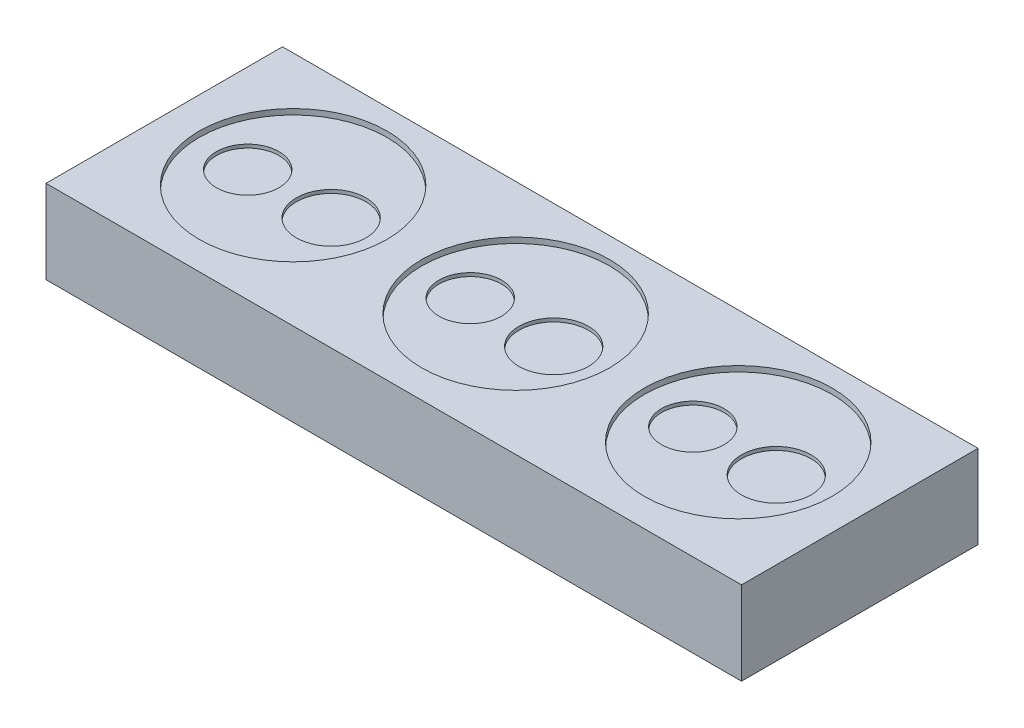
ISO-10303-21;
HEADER;
FILE_DESCRIPTION(('STEP AP214'),'2;1');
FILE_NAME('part.step','',(''),(''),'','','');
FILE_SCHEMA(('AUTOMOTIVE_DESIGN { 1 0 10303 214 1 1 1 1 }'));
ENDSEC;
DATA;
#1=APPLICATION_CONTEXT('core data for automotive mechanical design processes');
#2=APPLICATION_PROTOCOL_DEFINITION('international standard','automotive_design',2000,#1);
#3=PRODUCT_CONTEXT('',#1,'mechanical');
#4=PRODUCT('Part','Part','',(#3));
#5=PRODUCT_RELATED_PRODUCT_CATEGORY('part','',(#4));
#6=PRODUCT_DEFINITION_FORMATION('','',#4);
#7=PRODUCT_DEFINITION_CONTEXT('part definition',#1,'design');
#8=PRODUCT_DEFINITION('design','',#6,#7);
#9=PRODUCT_DEFINITION_SHAPE('','',#8);
#10=(LENGTH_UNIT() NAMED_UNIT(*) SI_UNIT(.MILLI.,.METRE.));
#11=(NAMED_UNIT(*) PLANE_ANGLE_UNIT() SI_UNIT($,.RADIAN.));
#12=(NAMED_UNIT(*) SI_UNIT($,.STERADIAN.) SOLID_ANGLE_UNIT());
#13=UNCERTAINTY_MEASURE_WITH_UNIT(LENGTH_MEASURE(1.E-05),#10,'distance_accuracy_value','');
#14=(GEOMETRIC_REPRESENTATION_CONTEXT(3) GLOBAL_UNCERTAINTY_ASSIGNED_CONTEXT((#13)) GLOBAL_UNIT_ASSIGNED_CONTEXT((#10,
#11,#12)) REPRESENTATION_CONTEXT('',''));
#15=CARTESIAN_POINT('',(0.,0.,0.));
#16=DIRECTION('',(0.,0.,1.));
#17=DIRECTION('',(1.,0.,0.));
#18=AXIS2_PLACEMENT_3D('',#15,#16,#17);
#19=CARTESIAN_POINT('',(-255.514705882353,60.,-108.455882352941));
#20=DIRECTION('',(1.,0.,0.));
#21=DIRECTION('',(0.,0.,-1.));
#22=AXIS2_PLACEMENT_3D('',#19,#20,#21);
#23=PLANE('',#22);
#24=DIRECTION('',(0.,0.,1.));
#25=VECTOR('',#24,1.);
#26=CARTESIAN_POINT('',(-255.514705882353,0.,-108.455882352941));
#27=LINE('',#26,#25);
#28=CARTESIAN_POINT('',(-255.514705882353,0.,-108.455882352941));
#29=VERTEX_POINT('',#28);
#30=CARTESIAN_POINT('',(-255.514705882353,0.,61.5441176470588));
#31=VERTEX_POINT('',#30);
#32=EDGE_CURVE('E96',#29,#31,#27,.T.);
#33=ORIENTED_EDGE('',*,*,#32,.T.);
#34=DIRECTION('',(0.,-1.,0.));
#35=VECTOR('',#34,1.);
#36=CARTESIAN_POINT('',(-255.514705882353,60.,61.5441176470588));
#37=LINE('',#36,#35);
#38=CARTESIAN_POINT('',(-255.514705882353,60.,61.5441176470588));
#39=VERTEX_POINT('',#38);
#40=EDGE_CURVE('E11',#39,#31,#37,.T.);
#41=ORIENTED_EDGE('',*,*,#40,.F.);
#42=DIRECTION('',(0.,0.,1.));
#43=VECTOR('',#42,1.);
#44=CARTESIAN_POINT('',(-255.514705882353,60.,-108.455882352941));
#45=LINE('',#44,#43);
#46=CARTESIAN_POINT('',(-255.514705882353,60.,-108.455882352941));
#47=VERTEX_POINT('',#46);
#48=EDGE_CURVE('E84',#47,#39,#45,.T.);
#49=ORIENTED_EDGE('',*,*,#48,.F.);
#50=DIRECTION('',(0.,-1.,0.));
#51=VECTOR('',#50,1.);
#52=CARTESIAN_POINT('',(-255.514705882353,60.,-108.455882352941));
#53=LINE('',#52,#51);
#54=EDGE_CURVE('E92',#47,#29,#53,.T.);
#55=ORIENTED_EDGE('',*,*,#54,.T.);
#56=EDGE_LOOP('',(#33,#41,#49,#55));
#57=FACE_BOUND('',#56,.T.);
#58=ADVANCED_FACE('F33',(#57),#23,.F.);
#59=CARTESIAN_POINT('',(-255.514705882353,60.,61.5441176470588));
#60=DIRECTION('',(0.,0.,-1.));
#61=DIRECTION('',(-1.,0.,0.));
#62=AXIS2_PLACEMENT_3D('',#59,#60,#61);
#63=PLANE('',#62);
#64=DIRECTION('',(1.,0.,0.));
#65=VECTOR('',#64,1.);
#66=CARTESIAN_POINT('',(-255.514705882353,0.,61.5441176470588));
#67=LINE('',#66,#65);
#68=CARTESIAN_POINT('',(244.485294117647,0.,61.5441176470588));
#69=VERTEX_POINT('',#68);
#70=EDGE_CURVE('E88',#31,#69,#67,.T.);
#71=ORIENTED_EDGE('',*,*,#70,.T.);
#72=DIRECTION('',(0.,-1.,0.));
#73=VECTOR('',#72,1.);
#74=CARTESIAN_POINT('',(244.485294117647,60.,61.5441176470588));
#75=LINE('',#74,#73);
#76=CARTESIAN_POINT('',(244.485294117647,60.,61.5441176470588));
#77=VERTEX_POINT('',#76);
#78=EDGE_CURVE('E41',#77,#69,#75,.T.);
#79=ORIENTED_EDGE('',*,*,#78,.F.);
#80=DIRECTION('',(1.,0.,0.));
#81=VECTOR('',#80,1.);
#82=CARTESIAN_POINT('',(-255.514705882353,60.,61.5441176470588));
#83=LINE('',#82,#81);
#84=EDGE_CURVE('E79',#39,#77,#83,.T.);
#85=ORIENTED_EDGE('',*,*,#84,.F.);
#86=ORIENTED_EDGE('',*,*,#40,.T.);
#87=EDGE_LOOP('',(#71,#79,#85,#86));
#88=FACE_BOUND('',#87,.T.);
#89=ADVANCED_FACE('F87',(#88),#63,.F.);
#90=CARTESIAN_POINT('',(244.485294117647,60.,-108.455882352941));
#91=DIRECTION('',(-1.,0.,0.));
#92=DIRECTION('',(0.,0.,1.));
#93=AXIS2_PLACEMENT_3D('',#90,#91,#92);
#94=PLANE('',#93);
#95=DIRECTION('',(0.,0.,-1.));
#96=VECTOR('',#95,1.);
#97=CARTESIAN_POINT('',(244.485294117647,0.,-108.455882352941));
#98=LINE('',#97,#96);
#99=CARTESIAN_POINT('',(244.485294117647,0.,-108.455882352941));
#100=VERTEX_POINT('',#99);
#101=EDGE_CURVE('E66',#69,#100,#98,.T.);
#102=ORIENTED_EDGE('',*,*,#101,.T.);
#103=DIRECTION('',(0.,-1.,0.));
#104=VECTOR('',#103,1.);
#105=CARTESIAN_POINT('',(244.485294117647,60.,-108.455882352941));
#106=LINE('',#105,#104);
#107=CARTESIAN_POINT('',(244.485294117647,60.,-108.455882352941));
#108=VERTEX_POINT('',#107);
#109=EDGE_CURVE('E89',#108,#100,#106,.T.);
#110=ORIENTED_EDGE('',*,*,#109,.F.);
#111=DIRECTION('',(0.,0.,-1.));
#112=VECTOR('',#111,1.);
#113=CARTESIAN_POINT('',(244.485294117647,60.,-108.455882352941));
#114=LINE('',#113,#112);
#115=EDGE_CURVE('E82',#77,#108,#114,.T.);
#116=ORIENTED_EDGE('',*,*,#115,.F.);
#117=ORIENTED_EDGE('',*,*,#78,.T.);
#118=EDGE_LOOP('',(#102,#110,#116,#117));
#119=FACE_BOUND('',#118,.T.);
#120=ADVANCED_FACE('F90',(#119),#94,.F.);
#121=CARTESIAN_POINT('',(-255.514705882353,60.,-108.455882352941));
#122=DIRECTION('',(0.,0.,1.));
#123=DIRECTION('',(1.,0.,0.));
#124=AXIS2_PLACEMENT_3D('',#121,#122,#123);
#125=PLANE('',#124);
#126=DIRECTION('',(-1.,0.,0.));
#127=VECTOR('',#126,1.);
#128=CARTESIAN_POINT('',(-255.514705882353,0.,-108.455882352941));
#129=LINE('',#128,#127);
#130=EDGE_CURVE('E72',#100,#29,#129,.T.);
#131=ORIENTED_EDGE('',*,*,#130,.T.);
#132=ORIENTED_EDGE('',*,*,#54,.F.);
#133=DIRECTION('',(-1.,0.,0.));
#134=VECTOR('',#133,1.);
#135=CARTESIAN_POINT('',(-255.514705882353,60.,-108.455882352941));
#136=LINE('',#135,#134);
#137=EDGE_CURVE('E49',#108,#47,#136,.T.);
#138=ORIENTED_EDGE('',*,*,#137,.F.);
#139=ORIENTED_EDGE('',*,*,#109,.T.);
#140=EDGE_LOOP('',(#131,#132,#138,#139));
#141=FACE_BOUND('',#140,.T.);
#142=ADVANCED_FACE('F104',(#141),#125,.F.);
#143=CARTESIAN_POINT('',(0.,60.,0.));
#144=DIRECTION('',(0.,1.,0.));
#145=DIRECTION('',(0.,0.,1.));
#146=AXIS2_PLACEMENT_3D('',#143,#144,#145);
#147=PLANE('',#146);
#148=CARTESIAN_POINT('',(-165.514705882353,60.,-26.0941233594731));
#149=DIRECTION('',(0.,1.,0.));
#150=DIRECTION('',(0.,0.,1.));
#151=AXIS2_PLACEMENT_3D('',#148,#149,#150);
#152=CIRCLE('',#151,67.5);
#153=CARTESIAN_POINT('',(-165.514705882353,60.,41.4058766405269));
#154=VERTEX_POINT('',#153);
#155=EDGE_CURVE('E116',#154,#154,#152,.T.);
#156=ORIENTED_EDGE('',*,*,#155,.F.);
#157=EDGE_LOOP('',(#156));
#158=FACE_BOUND('',#157,.T.);
#159=CARTESIAN_POINT('',(154.485294117647,60.,-26.0941233594731));
#160=DIRECTION('',(0.,1.,0.));
#161=DIRECTION('',(0.,0.,1.));
#162=AXIS2_PLACEMENT_3D('',#159,#160,#161);
#163=CIRCLE('',#162,67.5);
#164=CARTESIAN_POINT('',(154.485294117647,60.,41.4058766405269));
#165=VERTEX_POINT('',#164);
#166=EDGE_CURVE('E123',#165,#165,#163,.T.);
#167=ORIENTED_EDGE('',*,*,#166,.F.);
#168=EDGE_LOOP('',(#167));
#169=FACE_BOUND('',#168,.T.);
#170=CARTESIAN_POINT('',(-5.51470588235306,60.,-26.0941233594731));
#171=DIRECTION('',(0.,1.,0.));
#172=DIRECTION('',(0.,0.,1.));
#173=AXIS2_PLACEMENT_3D('',#170,#171,#172);
#174=CIRCLE('',#173,67.5);
#175=CARTESIAN_POINT('',(-5.51470588235306,60.,41.4058766405269));
#176=VERTEX_POINT('',#175);
#177=EDGE_CURVE('E110',#176,#176,#174,.T.);
#178=ORIENTED_EDGE('',*,*,#177,.F.);
#179=EDGE_LOOP('',(#178));
#180=FACE_BOUND('',#179,.T.);
#181=ORIENTED_EDGE('',*,*,#48,.T.);
#182=ORIENTED_EDGE('',*,*,#84,.T.);
#183=ORIENTED_EDGE('',*,*,#115,.T.);
#184=ORIENTED_EDGE('',*,*,#137,.T.);
#185=EDGE_LOOP('',(#181,#182,#183,#184));
#186=FACE_BOUND('',#185,.T.);
#187=ADVANCED_FACE('F80',(#158,#169,#180,#186),#147,.T.);
#188=CARTESIAN_POINT('',(0.,0.,0.));
#189=DIRECTION('',(0.,1.,0.));
#190=DIRECTION('',(0.,0.,1.));
#191=AXIS2_PLACEMENT_3D('',#188,#189,#190);
#192=PLANE('',#191);
#193=ORIENTED_EDGE('',*,*,#32,.F.);
#194=ORIENTED_EDGE('',*,*,#130,.F.);
#195=ORIENTED_EDGE('',*,*,#101,.F.);
#196=ORIENTED_EDGE('',*,*,#70,.F.);
#197=EDGE_LOOP('',(#193,#194,#195,#196));
#198=FACE_BOUND('',#197,.T.);
#199=ADVANCED_FACE('F107',(#198),#192,.F.);
#200=CARTESIAN_POINT('',(-5.51470588235306,56.,-26.0941233594731));
#201=DIRECTION('',(0.,1.,0.));
#202=DIRECTION('',(0.,0.,1.));
#203=AXIS2_PLACEMENT_3D('',#200,#201,#202);
#204=CYLINDRICAL_SURFACE('',#203,67.5);
#205=CARTESIAN_POINT('',(-5.51470588235306,56.,-26.0941233594731));
#206=DIRECTION('',(0.,1.,0.));
#207=DIRECTION('',(0.,0.,1.));
#208=AXIS2_PLACEMENT_3D('',#205,#206,#207);
#209=CIRCLE('',#208,67.5);
#210=CARTESIAN_POINT('',(-5.51470588235306,56.,41.4058766405269));
#211=VERTEX_POINT('',#210);
#212=EDGE_CURVE('E99',#211,#211,#209,.T.);
#213=ORIENTED_EDGE('',*,*,#212,.F.);
#214=EDGE_LOOP('',(#213));
#215=FACE_BOUND('',#214,.T.);
#216=ORIENTED_EDGE('',*,*,#177,.T.);
#217=EDGE_LOOP('',(#216));
#218=FACE_BOUND('',#217,.T.);
#219=ADVANCED_FACE('F194',(#215,#218),#204,.F.);
#220=CARTESIAN_POINT('',(-5.51470588235306,56.,-26.0941233594731));
#221=DIRECTION('',(0.,1.,0.));
#222=DIRECTION('',(0.,0.,1.));
#223=AXIS2_PLACEMENT_3D('',#220,#221,#222);
#224=PLANE('',#223);
#225=CARTESIAN_POINT('',(-35.514705882353,56.,-23.4558823529412));
#226=DIRECTION('',(0.,1.,0.));
#227=DIRECTION('',(0.,0.,1.));
#228=AXIS2_PLACEMENT_3D('',#225,#226,#227);
#229=CIRCLE('',#228,22.5);
#230=CARTESIAN_POINT('',(-35.514705882353,56.,-0.955882352941171));
#231=VERTEX_POINT('',#230);
#232=EDGE_CURVE('E153',#231,#231,#229,.T.);
#233=ORIENTED_EDGE('',*,*,#232,.F.);
#234=EDGE_LOOP('',(#233));
#235=FACE_BOUND('',#234,.T.);
#236=CARTESIAN_POINT('',(24.4852941176469,56.,-23.4558823529412));
#237=DIRECTION('',(0.,1.,0.));
#238=DIRECTION('',(0.,0.,1.));
#239=AXIS2_PLACEMENT_3D('',#236,#237,#238);
#240=CIRCLE('',#239,25.);
#241=CARTESIAN_POINT('',(24.4852941176469,56.,1.54411764705885));
#242=VERTEX_POINT('',#241);
#243=EDGE_CURVE('E134',#242,#242,#240,.T.);
#244=ORIENTED_EDGE('',*,*,#243,.F.);
#245=EDGE_LOOP('',(#244));
#246=FACE_BOUND('',#245,.T.);
#247=ORIENTED_EDGE('',*,*,#212,.T.);
#248=EDGE_LOOP('',(#247));
#249=FACE_BOUND('',#248,.T.);
#250=ADVANCED_FACE('F184',(#235,#246,#249),#224,.T.);
#251=CARTESIAN_POINT('',(154.485294117647,56.,-26.0941233594731));
#252=DIRECTION('',(0.,1.,0.));
#253=DIRECTION('',(0.,0.,1.));
#254=AXIS2_PLACEMENT_3D('',#251,#252,#253);
#255=CYLINDRICAL_SURFACE('',#254,67.5);
#256=CARTESIAN_POINT('',(154.485294117647,56.,-26.0941233594731));
#257=DIRECTION('',(0.,1.,0.));
#258=DIRECTION('',(0.,0.,1.));
#259=AXIS2_PLACEMENT_3D('',#256,#257,#258);
#260=CIRCLE('',#259,67.5);
#261=CARTESIAN_POINT('',(154.485294117647,56.,41.4058766405269));
#262=VERTEX_POINT('',#261);
#263=EDGE_CURVE('E113',#262,#262,#260,.T.);
#264=ORIENTED_EDGE('',*,*,#263,.F.);
#265=EDGE_LOOP('',(#264));
#266=FACE_BOUND('',#265,.T.);
#267=ORIENTED_EDGE('',*,*,#166,.T.);
#268=EDGE_LOOP('',(#267));
#269=FACE_BOUND('',#268,.T.);
#270=ADVANCED_FACE('F177',(#266,#269),#255,.F.);
#271=CARTESIAN_POINT('',(154.485294117647,56.,-26.0941233594731));
#272=DIRECTION('',(0.,1.,0.));
#273=DIRECTION('',(0.,0.,1.));
#274=AXIS2_PLACEMENT_3D('',#271,#272,#273);
#275=PLANE('',#274);
#276=CARTESIAN_POINT('',(184.485294117647,56.,-23.4558823529412));
#277=DIRECTION('',(0.,1.,0.));
#278=DIRECTION('',(0.,0.,1.));
#279=AXIS2_PLACEMENT_3D('',#276,#277,#278);
#280=CIRCLE('',#279,25.);
#281=CARTESIAN_POINT('',(184.485294117647,56.,1.54411764705885));
#282=VERTEX_POINT('',#281);
#283=EDGE_CURVE('E146',#282,#282,#280,.T.);
#284=ORIENTED_EDGE('',*,*,#283,.F.);
#285=EDGE_LOOP('',(#284));
#286=FACE_BOUND('',#285,.T.);
#287=CARTESIAN_POINT('',(124.485294117647,56.,-23.4558823529412));
#288=DIRECTION('',(0.,1.,0.));
#289=DIRECTION('',(0.,0.,1.));
#290=AXIS2_PLACEMENT_3D('',#287,#288,#289);
#291=CIRCLE('',#290,22.5);
#292=CARTESIAN_POINT('',(124.485294117647,56.,-0.955882352941171));
#293=VERTEX_POINT('',#292);
#294=EDGE_CURVE('E158',#293,#293,#291,.T.);
#295=ORIENTED_EDGE('',*,*,#294,.F.);
#296=EDGE_LOOP('',(#295));
#297=FACE_BOUND('',#296,.T.);
#298=ORIENTED_EDGE('',*,*,#263,.T.);
#299=EDGE_LOOP('',(#298));
#300=FACE_BOUND('',#299,.T.);
#301=ADVANCED_FACE('F173',(#286,#297,#300),#275,.T.);
#302=CARTESIAN_POINT('',(-165.514705882353,56.,-26.0941233594731));
#303=DIRECTION('',(0.,1.,0.));
#304=DIRECTION('',(0.,0.,1.));
#305=AXIS2_PLACEMENT_3D('',#302,#303,#304);
#306=CYLINDRICAL_SURFACE('',#305,67.5);
#307=CARTESIAN_POINT('',(-165.514705882353,56.,-26.0941233594731));
#308=DIRECTION('',(0.,1.,0.));
#309=DIRECTION('',(0.,0.,1.));
#310=AXIS2_PLACEMENT_3D('',#307,#308,#309);
#311=CIRCLE('',#310,67.5);
#312=CARTESIAN_POINT('',(-165.514705882353,56.,41.4058766405269));
#313=VERTEX_POINT('',#312);
#314=EDGE_CURVE('E119',#313,#313,#311,.T.);
#315=ORIENTED_EDGE('',*,*,#314,.F.);
#316=EDGE_LOOP('',(#315));
#317=FACE_BOUND('',#316,.T.);
#318=ORIENTED_EDGE('',*,*,#155,.T.);
#319=EDGE_LOOP('',(#318));
#320=FACE_BOUND('',#319,.T.);
#321=ADVANCED_FACE('F176',(#317,#320),#306,.F.);
#322=CARTESIAN_POINT('',(-165.514705882353,56.,-26.0941233594731));
#323=DIRECTION('',(0.,1.,0.));
#324=DIRECTION('',(0.,0.,1.));
#325=AXIS2_PLACEMENT_3D('',#322,#323,#324);
#326=PLANE('',#325);
#327=CARTESIAN_POINT('',(-195.514705882353,56.,-23.4558823529412));
#328=DIRECTION('',(0.,1.,0.));
#329=DIRECTION('',(0.,0.,1.));
#330=AXIS2_PLACEMENT_3D('',#327,#328,#329);
#331=CIRCLE('',#330,22.5);
#332=CARTESIAN_POINT('',(-195.514705882353,56.,-0.955882352941171));
#333=VERTEX_POINT('',#332);
#334=EDGE_CURVE('E141',#333,#333,#331,.T.);
#335=ORIENTED_EDGE('',*,*,#334,.F.);
#336=EDGE_LOOP('',(#335));
#337=FACE_BOUND('',#336,.T.);
#338=CARTESIAN_POINT('',(-135.514705882353,56.,-23.4558823529412));
#339=DIRECTION('',(0.,1.,0.));
#340=DIRECTION('',(0.,0.,1.));
#341=AXIS2_PLACEMENT_3D('',#338,#339,#340);
#342=CIRCLE('',#341,25.);
#343=CARTESIAN_POINT('',(-135.514705882353,56.,1.54411764705885));
#344=VERTEX_POINT('',#343);
#345=EDGE_CURVE('E128',#344,#344,#342,.T.);
#346=ORIENTED_EDGE('',*,*,#345,.F.);
#347=EDGE_LOOP('',(#346));
#348=FACE_BOUND('',#347,.T.);
#349=ORIENTED_EDGE('',*,*,#314,.T.);
#350=EDGE_LOOP('',(#349));
#351=FACE_BOUND('',#350,.T.);
#352=ADVANCED_FACE('F259',(#337,#348,#351),#326,.T.);
#353=CARTESIAN_POINT('',(-135.514705882353,53.5,-23.4558823529412));
#354=DIRECTION('',(0.,1.,0.));
#355=DIRECTION('',(0.,0.,1.));
#356=AXIS2_PLACEMENT_3D('',#353,#354,#355);
#357=CYLINDRICAL_SURFACE('',#356,25.);
#358=CARTESIAN_POINT('',(-135.514705882353,53.5,-23.4558823529412));
#359=DIRECTION('',(0.,1.,0.));
#360=DIRECTION('',(0.,0.,1.));
#361=AXIS2_PLACEMENT_3D('',#358,#359,#360);
#362=CIRCLE('',#361,25.);
#363=CARTESIAN_POINT('',(-135.514705882353,53.5,1.54411764705885));
#364=VERTEX_POINT('',#363);
#365=EDGE_CURVE('E120',#364,#364,#362,.T.);
#366=ORIENTED_EDGE('',*,*,#365,.F.);
#367=EDGE_LOOP('',(#366));
#368=FACE_BOUND('',#367,.T.);
#369=ORIENTED_EDGE('',*,*,#345,.T.);
#370=EDGE_LOOP('',(#369));
#371=FACE_BOUND('',#370,.T.);
#372=ADVANCED_FACE('F268',(#368,#371),#357,.F.);
#373=CARTESIAN_POINT('',(-135.514705882353,53.5,-23.4558823529412));
#374=DIRECTION('',(0.,1.,0.));
#375=DIRECTION('',(0.,0.,1.));
#376=AXIS2_PLACEMENT_3D('',#373,#374,#375);
#377=PLANE('',#376);
#378=ORIENTED_EDGE('',*,*,#365,.T.);
#379=EDGE_LOOP('',(#378));
#380=FACE_BOUND('',#379,.T.);
#381=ADVANCED_FACE('F277',(#380),#377,.T.);
#382=CARTESIAN_POINT('',(-195.514705882353,53.5,-23.4558823529412));
#383=DIRECTION('',(0.,1.,0.));
#384=DIRECTION('',(0.,0.,1.));
#385=AXIS2_PLACEMENT_3D('',#382,#383,#384);
#386=CYLINDRICAL_SURFACE('',#385,22.5);
#387=CARTESIAN_POINT('',(-195.514705882353,53.5,-23.4558823529412));
#388=DIRECTION('',(0.,1.,0.));
#389=DIRECTION('',(0.,0.,1.));
#390=AXIS2_PLACEMENT_3D('',#387,#388,#389);
#391=CIRCLE('',#390,22.5);
#392=CARTESIAN_POINT('',(-195.514705882353,53.5,-0.955882352941171));
#393=VERTEX_POINT('',#392);
#394=EDGE_CURVE('E131',#393,#393,#391,.T.);
#395=ORIENTED_EDGE('',*,*,#394,.F.);
#396=EDGE_LOOP('',(#395));
#397=FACE_BOUND('',#396,.T.);
#398=ORIENTED_EDGE('',*,*,#334,.T.);
#399=EDGE_LOOP('',(#398));
#400=FACE_BOUND('',#399,.T.);
#401=ADVANCED_FACE('F286',(#397,#400),#386,.F.);
#402=CARTESIAN_POINT('',(-195.514705882353,53.5,-23.4558823529412));
#403=DIRECTION('',(0.,1.,0.));
#404=DIRECTION('',(0.,0.,1.));
#405=AXIS2_PLACEMENT_3D('',#402,#403,#404);
#406=PLANE('',#405);
#407=ORIENTED_EDGE('',*,*,#394,.T.);
#408=EDGE_LOOP('',(#407));
#409=FACE_BOUND('',#408,.T.);
#410=ADVANCED_FACE('F169',(#409),#406,.T.);
#411=CARTESIAN_POINT('',(124.485294117647,53.5,-23.4558823529412));
#412=DIRECTION('',(0.,1.,0.));
#413=DIRECTION('',(0.,0.,1.));
#414=AXIS2_PLACEMENT_3D('',#411,#412,#413);
#415=CYLINDRICAL_SURFACE('',#414,22.5);
#416=CARTESIAN_POINT('',(124.485294117647,53.5,-23.4558823529412));
#417=DIRECTION('',(0.,1.,0.));
#418=DIRECTION('',(0.,0.,1.));
#419=AXIS2_PLACEMENT_3D('',#416,#417,#418);
#420=CIRCLE('',#419,22.5);
#421=CARTESIAN_POINT('',(124.485294117647,53.5,-0.955882352941171));
#422=VERTEX_POINT('',#421);
#423=EDGE_CURVE('E150',#422,#422,#420,.T.);
#424=ORIENTED_EDGE('',*,*,#423,.F.);
#425=EDGE_LOOP('',(#424));
#426=FACE_BOUND('',#425,.T.);
#427=ORIENTED_EDGE('',*,*,#294,.T.);
#428=EDGE_LOOP('',(#427));
#429=FACE_BOUND('',#428,.T.);
#430=ADVANCED_FACE('F166',(#426,#429),#415,.F.);
#431=CARTESIAN_POINT('',(124.485294117647,53.5,-23.4558823529412));
#432=DIRECTION('',(0.,1.,0.));
#433=DIRECTION('',(0.,0.,1.));
#434=AXIS2_PLACEMENT_3D('',#431,#432,#433);
#435=PLANE('',#434);
#436=ORIENTED_EDGE('',*,*,#423,.T.);
#437=EDGE_LOOP('',(#436));
#438=FACE_BOUND('',#437,.T.);
#439=ADVANCED_FACE('F164',(#438),#435,.T.);
#440=CARTESIAN_POINT('',(184.485294117647,53.5,-23.4558823529412));
#441=DIRECTION('',(0.,1.,0.));
#442=DIRECTION('',(0.,0.,1.));
#443=AXIS2_PLACEMENT_3D('',#440,#441,#442);
#444=CYLINDRICAL_SURFACE('',#443,25.);
#445=CARTESIAN_POINT('',(184.485294117647,53.5,-23.4558823529412));
#446=DIRECTION('',(0.,1.,0.));
#447=DIRECTION('',(0.,0.,1.));
#448=AXIS2_PLACEMENT_3D('',#445,#446,#447);
#449=CIRCLE('',#448,25.);
#450=CARTESIAN_POINT('',(184.485294117647,53.5,1.54411764705885));
#451=VERTEX_POINT('',#450);
#452=EDGE_CURVE('E149',#451,#451,#449,.T.);
#453=ORIENTED_EDGE('',*,*,#452,.F.);
#454=EDGE_LOOP('',(#453));
#455=FACE_BOUND('',#454,.T.);
#456=ORIENTED_EDGE('',*,*,#283,.T.);
#457=EDGE_LOOP('',(#456));
#458=FACE_BOUND('',#457,.T.);
#459=ADVANCED_FACE('F316',(#455,#458),#444,.F.);
#460=CARTESIAN_POINT('',(184.485294117647,53.5,-23.4558823529412));
#461=DIRECTION('',(0.,1.,0.));
#462=DIRECTION('',(0.,0.,1.));
#463=AXIS2_PLACEMENT_3D('',#460,#461,#462);
#464=PLANE('',#463);
#465=ORIENTED_EDGE('',*,*,#452,.T.);
#466=EDGE_LOOP('',(#465));
#467=FACE_BOUND('',#466,.T.);
#468=ADVANCED_FACE('F324',(#467),#464,.T.);
#469=CARTESIAN_POINT('',(24.4852941176469,53.5,-23.4558823529412));
#470=DIRECTION('',(0.,1.,0.));
#471=DIRECTION('',(0.,0.,1.));
#472=AXIS2_PLACEMENT_3D('',#469,#470,#471);
#473=CYLINDRICAL_SURFACE('',#472,25.);
#474=CARTESIAN_POINT('',(24.4852941176469,53.5,-23.4558823529412));
#475=DIRECTION('',(0.,1.,0.));
#476=DIRECTION('',(0.,0.,1.));
#477=AXIS2_PLACEMENT_3D('',#474,#475,#476);
#478=CIRCLE('',#477,25.);
#479=CARTESIAN_POINT('',(24.4852941176469,53.5,1.54411764705885));
#480=VERTEX_POINT('',#479);
#481=EDGE_CURVE('E137',#480,#480,#478,.T.);
#482=ORIENTED_EDGE('',*,*,#481,.F.);
#483=EDGE_LOOP('',(#482));
#484=FACE_BOUND('',#483,.T.);
#485=ORIENTED_EDGE('',*,*,#243,.T.);
#486=EDGE_LOOP('',(#485));
#487=FACE_BOUND('',#486,.T.);
#488=ADVANCED_FACE('F333',(#484,#487),#473,.F.);
#489=CARTESIAN_POINT('',(24.4852941176469,53.5,-23.4558823529412));
#490=DIRECTION('',(0.,1.,0.));
#491=DIRECTION('',(0.,0.,1.));
#492=AXIS2_PLACEMENT_3D('',#489,#490,#491);
#493=PLANE('',#492);
#494=ORIENTED_EDGE('',*,*,#481,.T.);
#495=EDGE_LOOP('',(#494));
#496=FACE_BOUND('',#495,.T.);
#497=ADVANCED_FACE('F342',(#496),#493,.T.);
#498=CARTESIAN_POINT('',(-35.514705882353,53.5,-23.4558823529412));
#499=DIRECTION('',(0.,1.,0.));
#500=DIRECTION('',(0.,0.,1.));
#501=AXIS2_PLACEMENT_3D('',#498,#499,#500);
#502=CYLINDRICAL_SURFACE('',#501,22.5);
#503=CARTESIAN_POINT('',(-35.514705882353,53.5,-23.4558823529412));
#504=DIRECTION('',(0.,1.,0.));
#505=DIRECTION('',(0.,0.,1.));
#506=AXIS2_PLACEMENT_3D('',#503,#504,#505);
#507=CIRCLE('',#506,22.5);
#508=CARTESIAN_POINT('',(-35.514705882353,53.5,-0.955882352941171));
#509=VERTEX_POINT('',#508);
#510=EDGE_CURVE('E138',#509,#509,#507,.T.);
#511=ORIENTED_EDGE('',*,*,#510,.F.);
#512=EDGE_LOOP('',(#511));
#513=FACE_BOUND('',#512,.T.);
#514=ORIENTED_EDGE('',*,*,#232,.T.);
#515=EDGE_LOOP('',(#514));
#516=FACE_BOUND('',#515,.T.);
#517=ADVANCED_FACE('F351',(#513,#516),#502,.F.);
#518=CARTESIAN_POINT('',(-35.514705882353,53.5,-23.4558823529412));
#519=DIRECTION('',(0.,1.,0.));
#520=DIRECTION('',(0.,0.,1.));
#521=AXIS2_PLACEMENT_3D('',#518,#519,#520);
#522=PLANE('',#521);
#523=ORIENTED_EDGE('',*,*,#510,.T.);
#524=EDGE_LOOP('',(#523));
#525=FACE_BOUND('',#524,.T.);
#526=ADVANCED_FACE('F360',(#525),#522,.T.);
#527=CLOSED_SHELL('',(#58,#89,#120,#142,#187,#199,#219,#250,#270,#301,#321,#352,#372,#381,#401,
#410,#430,#439,#459,#468,#488,#497,#517,#526));
#528=MANIFOLD_SOLID_BREP('B2',#527);
#529=ADVANCED_BREP_SHAPE_REPRESENTATION('',(#18,#528),#14);
#530=SHAPE_DEFINITION_REPRESENTATION(#9,#529);
ENDSEC;
END-ISO-10303-21;
